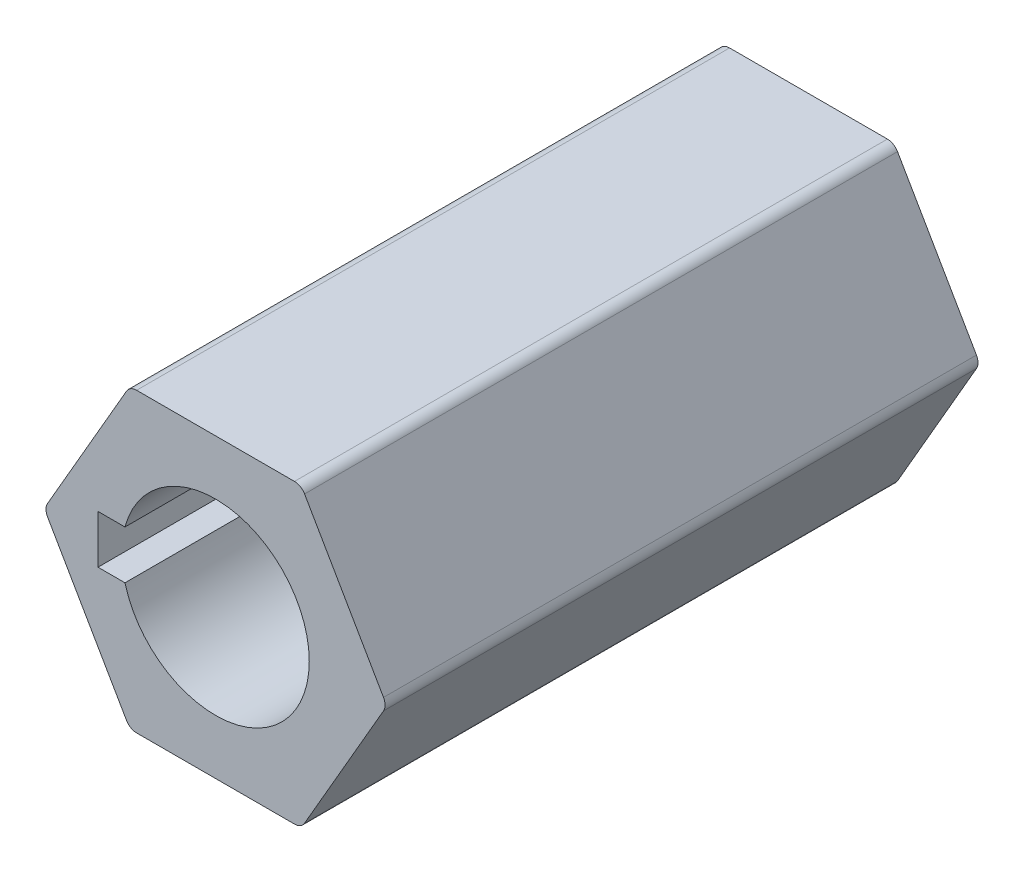
ISO-10303-21;
HEADER;
FILE_DESCRIPTION(('STEP AP214'),'2;1');
FILE_NAME('part.step','',(''),(''),'','','');
FILE_SCHEMA(('AUTOMOTIVE_DESIGN { 1 0 10303 214 1 1 1 1 }'));
ENDSEC;
DATA;
#1=APPLICATION_CONTEXT('core data for automotive mechanical design processes');
#2=APPLICATION_PROTOCOL_DEFINITION('international standard','automotive_design',2000,#1);
#3=PRODUCT_CONTEXT('',#1,'mechanical');
#4=PRODUCT('Part','Part','',(#3));
#5=PRODUCT_RELATED_PRODUCT_CATEGORY('part','',(#4));
#6=PRODUCT_DEFINITION_FORMATION('','',#4);
#7=PRODUCT_DEFINITION_CONTEXT('part definition',#1,'design');
#8=PRODUCT_DEFINITION('design','',#6,#7);
#9=PRODUCT_DEFINITION_SHAPE('','',#8);
#10=(LENGTH_UNIT() NAMED_UNIT(*) SI_UNIT(.MILLI.,.METRE.));
#11=(NAMED_UNIT(*) PLANE_ANGLE_UNIT() SI_UNIT($,.RADIAN.));
#12=(NAMED_UNIT(*) SI_UNIT($,.STERADIAN.) SOLID_ANGLE_UNIT());
#13=UNCERTAINTY_MEASURE_WITH_UNIT(LENGTH_MEASURE(1.E-05),#10,'distance_accuracy_value','');
#14=(GEOMETRIC_REPRESENTATION_CONTEXT(3) GLOBAL_UNCERTAINTY_ASSIGNED_CONTEXT((#13)) GLOBAL_UNIT_ASSIGNED_CONTEXT((#10,
#11,#12)) REPRESENTATION_CONTEXT('',''));
#15=CARTESIAN_POINT('',(0.,0.,0.));
#16=DIRECTION('',(0.,0.,1.));
#17=DIRECTION('',(1.,0.,0.));
#18=AXIS2_PLACEMENT_3D('',#15,#16,#17);
#19=CARTESIAN_POINT('',(3.38116524896868,5.85635,12.7));
#20=DIRECTION('',(0.,0.,-1.));
#21=DIRECTION('',(-1.,0.,0.));
#22=AXIS2_PLACEMENT_3D('',#19,#20,#21);
#23=CYLINDRICAL_SURFACE('',#22,0.5);
#24=CARTESIAN_POINT('',(3.38116524896868,5.85635,12.7));
#25=DIRECTION('',(0.,0.,1.));
#26=DIRECTION('',(1.,0.,0.));
#27=AXIS2_PLACEMENT_3D('',#24,#25,#26);
#28=CIRCLE('',#27,0.5);
#29=CARTESIAN_POINT('',(3.81417795086089,6.10635,12.7));
#30=VERTEX_POINT('',#29);
#31=CARTESIAN_POINT('',(3.38116524896868,6.35635,12.7));
#32=VERTEX_POINT('',#31);
#33=EDGE_CURVE('E225',#30,#32,#28,.T.);
#34=ORIENTED_EDGE('',*,*,#33,.F.);
#35=DIRECTION('',(0.,0.,1.));
#36=VECTOR('',#35,1.);
#37=CARTESIAN_POINT('',(3.81417795086089,6.10635,12.7));
#38=LINE('',#37,#36);
#39=CARTESIAN_POINT('',(3.81417795086089,6.10635,-12.7));
#40=VERTEX_POINT('',#39);
#41=EDGE_CURVE('E212',#40,#30,#38,.T.);
#42=ORIENTED_EDGE('',*,*,#41,.F.);
#43=CARTESIAN_POINT('',(3.38116524896868,5.85635,-12.7));
#44=DIRECTION('',(0.,0.,-1.));
#45=DIRECTION('',(1.,0.,0.));
#46=AXIS2_PLACEMENT_3D('',#43,#44,#45);
#47=CIRCLE('',#46,0.5);
#48=CARTESIAN_POINT('',(3.38116524896868,6.35635,-12.7));
#49=VERTEX_POINT('',#48);
#50=EDGE_CURVE('E220',#49,#40,#47,.T.);
#51=ORIENTED_EDGE('',*,*,#50,.F.);
#52=DIRECTION('',(0.,0.,-1.));
#53=VECTOR('',#52,1.);
#54=CARTESIAN_POINT('',(3.38116524896868,6.35635,12.7));
#55=LINE('',#54,#53);
#56=EDGE_CURVE('E169',#32,#49,#55,.T.);
#57=ORIENTED_EDGE('',*,*,#56,.F.);
#58=EDGE_LOOP('',(#34,#42,#51,#57));
#59=FACE_BOUND('',#58,.T.);
#60=ADVANCED_FACE('F16',(#59),#23,.T.);
#61=CARTESIAN_POINT('',(-3.38116524896865,5.85635,12.7));
#62=DIRECTION('',(0.,0.,-1.));
#63=DIRECTION('',(-1.,0.,0.));
#64=AXIS2_PLACEMENT_3D('',#61,#62,#63);
#65=CYLINDRICAL_SURFACE('',#64,0.5);
#66=CARTESIAN_POINT('',(-3.38116524896865,5.85635,12.7));
#67=DIRECTION('',(0.,0.,1.));
#68=DIRECTION('',(1.,0.,0.));
#69=AXIS2_PLACEMENT_3D('',#66,#67,#68);
#70=CIRCLE('',#69,0.5);
#71=CARTESIAN_POINT('',(-3.38116524896865,6.35635,12.7));
#72=VERTEX_POINT('',#71);
#73=CARTESIAN_POINT('',(-3.81417795086087,6.10635,12.7));
#74=VERTEX_POINT('',#73);
#75=EDGE_CURVE('E258',#72,#74,#70,.T.);
#76=ORIENTED_EDGE('',*,*,#75,.F.);
#77=DIRECTION('',(0.,0.,1.));
#78=VECTOR('',#77,1.);
#79=CARTESIAN_POINT('',(-3.38116524896865,6.35635,12.7));
#80=LINE('',#79,#78);
#81=CARTESIAN_POINT('',(-3.38116524896865,6.35635,-12.7));
#82=VERTEX_POINT('',#81);
#83=EDGE_CURVE('E237',#82,#72,#80,.T.);
#84=ORIENTED_EDGE('',*,*,#83,.F.);
#85=CARTESIAN_POINT('',(-3.38116524896865,5.85635,-12.7));
#86=DIRECTION('',(0.,0.,-1.));
#87=DIRECTION('',(1.,0.,0.));
#88=AXIS2_PLACEMENT_3D('',#85,#86,#87);
#89=CIRCLE('',#88,0.5);
#90=CARTESIAN_POINT('',(-3.81417795086087,6.10635,-12.7));
#91=VERTEX_POINT('',#90);
#92=EDGE_CURVE('E188',#91,#82,#89,.T.);
#93=ORIENTED_EDGE('',*,*,#92,.F.);
#94=DIRECTION('',(0.,0.,-1.));
#95=VECTOR('',#94,1.);
#96=CARTESIAN_POINT('',(-3.81417795086087,6.10635,12.7));
#97=LINE('',#96,#95);
#98=EDGE_CURVE('E274',#74,#91,#97,.T.);
#99=ORIENTED_EDGE('',*,*,#98,.F.);
#100=EDGE_LOOP('',(#76,#84,#93,#99));
#101=FACE_BOUND('',#100,.T.);
#102=ADVANCED_FACE('F331',(#101),#65,.T.);
#103=CARTESIAN_POINT('',(6.76233049793735,0.,12.7));
#104=DIRECTION('',(0.,0.,-1.));
#105=DIRECTION('',(-1.,0.,0.));
#106=AXIS2_PLACEMENT_3D('',#103,#104,#105);
#107=CYLINDRICAL_SURFACE('',#106,0.5);
#108=CARTESIAN_POINT('',(6.76233049793735,0.,12.7));
#109=DIRECTION('',(0.,0.,1.));
#110=DIRECTION('',(1.,0.,0.));
#111=AXIS2_PLACEMENT_3D('',#108,#109,#110);
#112=CIRCLE('',#111,0.5);
#113=CARTESIAN_POINT('',(7.19534319982957,-0.250000000000018,12.7));
#114=VERTEX_POINT('',#113);
#115=CARTESIAN_POINT('',(7.19534319982957,0.249999999999985,12.7));
#116=VERTEX_POINT('',#115);
#117=EDGE_CURVE('E20',#114,#116,#112,.T.);
#118=ORIENTED_EDGE('',*,*,#117,.F.);
#119=DIRECTION('',(0.,0.,1.));
#120=VECTOR('',#119,1.);
#121=CARTESIAN_POINT('',(7.19534319982957,-0.250000000000016,12.7));
#122=LINE('',#121,#120);
#123=CARTESIAN_POINT('',(7.19534319982957,-0.250000000000018,-12.7));
#124=VERTEX_POINT('',#123);
#125=EDGE_CURVE('E238',#124,#114,#122,.T.);
#126=ORIENTED_EDGE('',*,*,#125,.F.);
#127=CARTESIAN_POINT('',(6.76233049793735,0.,-12.7));
#128=DIRECTION('',(0.,0.,-1.));
#129=DIRECTION('',(1.,0.,0.));
#130=AXIS2_PLACEMENT_3D('',#127,#128,#129);
#131=CIRCLE('',#130,0.5);
#132=CARTESIAN_POINT('',(7.19534319982957,0.249999999999985,-12.7));
#133=VERTEX_POINT('',#132);
#134=EDGE_CURVE('E205',#133,#124,#131,.T.);
#135=ORIENTED_EDGE('',*,*,#134,.F.);
#136=DIRECTION('',(0.,0.,-1.));
#137=VECTOR('',#136,1.);
#138=CARTESIAN_POINT('',(7.19534319982957,0.249999999999985,12.7));
#139=LINE('',#138,#137);
#140=EDGE_CURVE('E215',#116,#133,#139,.T.);
#141=ORIENTED_EDGE('',*,*,#140,.F.);
#142=EDGE_LOOP('',(#118,#126,#135,#141));
#143=FACE_BOUND('',#142,.T.);
#144=ADVANCED_FACE('F18',(#143),#107,.T.);
#145=CARTESIAN_POINT('',(3.38116524896867,-5.85635,12.7));
#146=DIRECTION('',(0.,0.,-1.));
#147=DIRECTION('',(-1.,0.,0.));
#148=AXIS2_PLACEMENT_3D('',#145,#146,#147);
#149=CYLINDRICAL_SURFACE('',#148,0.5);
#150=CARTESIAN_POINT('',(3.38116524896867,-5.85635,12.7));
#151=DIRECTION('',(0.,0.,1.));
#152=DIRECTION('',(1.,0.,0.));
#153=AXIS2_PLACEMENT_3D('',#150,#151,#152);
#154=CIRCLE('',#153,0.5);
#155=CARTESIAN_POINT('',(3.38116524896867,-6.35635,12.7));
#156=VERTEX_POINT('',#155);
#157=CARTESIAN_POINT('',(3.81417795086089,-6.10635,12.7));
#158=VERTEX_POINT('',#157);
#159=EDGE_CURVE('E255',#156,#158,#154,.T.);
#160=ORIENTED_EDGE('',*,*,#159,.F.);
#161=DIRECTION('',(0.,0.,1.));
#162=VECTOR('',#161,1.);
#163=CARTESIAN_POINT('',(3.38116524896867,-6.35635,12.7));
#164=LINE('',#163,#162);
#165=CARTESIAN_POINT('',(3.38116524896867,-6.35635,-12.7));
#166=VERTEX_POINT('',#165);
#167=EDGE_CURVE('E176',#166,#156,#164,.T.);
#168=ORIENTED_EDGE('',*,*,#167,.F.);
#169=CARTESIAN_POINT('',(3.38116524896867,-5.85635,-12.7));
#170=DIRECTION('',(0.,0.,-1.));
#171=DIRECTION('',(1.,0.,0.));
#172=AXIS2_PLACEMENT_3D('',#169,#170,#171);
#173=CIRCLE('',#172,0.5);
#174=CARTESIAN_POINT('',(3.81417795086089,-6.10635,-12.7));
#175=VERTEX_POINT('',#174);
#176=EDGE_CURVE('E175',#175,#166,#173,.T.);
#177=ORIENTED_EDGE('',*,*,#176,.F.);
#178=DIRECTION('',(0.,0.,-1.));
#179=VECTOR('',#178,1.);
#180=CARTESIAN_POINT('',(3.81417795086089,-6.10635,12.7));
#181=LINE('',#180,#179);
#182=EDGE_CURVE('E179',#158,#175,#181,.T.);
#183=ORIENTED_EDGE('',*,*,#182,.F.);
#184=EDGE_LOOP('',(#160,#168,#177,#183));
#185=FACE_BOUND('',#184,.T.);
#186=ADVANCED_FACE('F451',(#185),#149,.T.);
#187=CARTESIAN_POINT('',(-6.76233049793731,0.,12.7));
#188=DIRECTION('',(0.,0.,-1.));
#189=DIRECTION('',(-1.,0.,0.));
#190=AXIS2_PLACEMENT_3D('',#187,#188,#189);
#191=CYLINDRICAL_SURFACE('',#190,0.5);
#192=DIRECTION('',(0.,0.,-1.));
#193=VECTOR('',#192,1.);
#194=CARTESIAN_POINT('',(-7.26233049793732,0.,12.7));
#195=LINE('',#194,#193);
#196=CARTESIAN_POINT('',(-7.26233049793732,0.,12.7));
#197=VERTEX_POINT('',#196);
#198=CARTESIAN_POINT('',(-7.26233049793732,0.,-12.7));
#199=VERTEX_POINT('',#198);
#200=EDGE_CURVE('E206',#197,#199,#195,.T.);
#201=ORIENTED_EDGE('',*,*,#200,.F.);
#202=CARTESIAN_POINT('',(-6.76233049793731,0.,12.7));
#203=DIRECTION('',(0.,0.,1.));
#204=DIRECTION('',(1.,0.,0.));
#205=AXIS2_PLACEMENT_3D('',#202,#203,#204);
#206=CIRCLE('',#205,0.5);
#207=CARTESIAN_POINT('',(-7.19534319982953,0.25,12.7));
#208=VERTEX_POINT('',#207);
#209=EDGE_CURVE('E183',#208,#197,#206,.T.);
#210=ORIENTED_EDGE('',*,*,#209,.F.);
#211=DIRECTION('',(0.,0.,1.));
#212=VECTOR('',#211,1.);
#213=CARTESIAN_POINT('',(-7.19534319982953,0.25,12.7));
#214=LINE('',#213,#212);
#215=CARTESIAN_POINT('',(-7.19534319982953,0.25,-12.7));
#216=VERTEX_POINT('',#215);
#217=EDGE_CURVE('E270',#216,#208,#214,.T.);
#218=ORIENTED_EDGE('',*,*,#217,.F.);
#219=CARTESIAN_POINT('',(-6.76233049793731,0.,-12.7));
#220=DIRECTION('',(0.,0.,-1.));
#221=DIRECTION('',(1.,0.,0.));
#222=AXIS2_PLACEMENT_3D('',#219,#220,#221);
#223=CIRCLE('',#222,0.5);
#224=EDGE_CURVE('E189',#199,#216,#223,.T.);
#225=ORIENTED_EDGE('',*,*,#224,.F.);
#226=EDGE_LOOP('',(#201,#210,#218,#225));
#227=FACE_BOUND('',#226,.T.);
#228=ADVANCED_FACE('F344',(#227),#191,.T.);
#229=CARTESIAN_POINT('',(-3.38116524896863,-5.85635,12.7));
#230=DIRECTION('',(0.,0.,-1.));
#231=DIRECTION('',(-1.,0.,0.));
#232=AXIS2_PLACEMENT_3D('',#229,#230,#231);
#233=CYLINDRICAL_SURFACE('',#232,0.5);
#234=CARTESIAN_POINT('',(-3.38116524896863,-5.85635,12.7));
#235=DIRECTION('',(0.,0.,1.));
#236=DIRECTION('',(1.,0.,0.));
#237=AXIS2_PLACEMENT_3D('',#234,#235,#236);
#238=CIRCLE('',#237,0.5);
#239=CARTESIAN_POINT('',(-3.81417795086084,-6.10635,12.7));
#240=VERTEX_POINT('',#239);
#241=CARTESIAN_POINT('',(-3.38116524896863,-6.35635,12.7));
#242=VERTEX_POINT('',#241);
#243=EDGE_CURVE('E256',#240,#242,#238,.T.);
#244=ORIENTED_EDGE('',*,*,#243,.F.);
#245=DIRECTION('',(0.,0.,1.));
#246=VECTOR('',#245,1.);
#247=CARTESIAN_POINT('',(-3.81417795086084,-6.10635,12.7));
#248=LINE('',#247,#246);
#249=CARTESIAN_POINT('',(-3.81417795086084,-6.10635,-12.7));
#250=VERTEX_POINT('',#249);
#251=EDGE_CURVE('E197',#250,#240,#248,.T.);
#252=ORIENTED_EDGE('',*,*,#251,.F.);
#253=CARTESIAN_POINT('',(-3.38116524896863,-5.85635,-12.7));
#254=DIRECTION('',(0.,0.,-1.));
#255=DIRECTION('',(1.,0.,0.));
#256=AXIS2_PLACEMENT_3D('',#253,#254,#255);
#257=CIRCLE('',#256,0.5);
#258=CARTESIAN_POINT('',(-3.38116524896863,-6.35635,-12.7));
#259=VERTEX_POINT('',#258);
#260=EDGE_CURVE('E234',#259,#250,#257,.T.);
#261=ORIENTED_EDGE('',*,*,#260,.F.);
#262=DIRECTION('',(0.,0.,-1.));
#263=VECTOR('',#262,1.);
#264=CARTESIAN_POINT('',(-3.38116524896863,-6.35635,12.7));
#265=LINE('',#264,#263);
#266=EDGE_CURVE('E180',#242,#259,#265,.T.);
#267=ORIENTED_EDGE('',*,*,#266,.F.);
#268=EDGE_LOOP('',(#244,#252,#261,#267));
#269=FACE_BOUND('',#268,.T.);
#270=ADVANCED_FACE('F438',(#269),#233,.T.);
#271=CARTESIAN_POINT('',(-3.87930406129759,-1.035,12.7));
#272=DIRECTION('',(0.,1.,0.));
#273=DIRECTION('',(1.,0.,0.));
#274=AXIS2_PLACEMENT_3D('',#271,#272,#273);
#275=PLANE('',#274);
#276=DIRECTION('',(1.,0.,0.));
#277=VECTOR('',#276,1.);
#278=CARTESIAN_POINT('',(-3.87930406129759,-1.035,-12.7));
#279=LINE('',#278,#277);
#280=CARTESIAN_POINT('',(-5.035,-1.035,-12.7));
#281=VERTEX_POINT('',#280);
#282=CARTESIAN_POINT('',(-3.87930406129759,-1.035,-12.7));
#283=VERTEX_POINT('',#282);
#284=EDGE_CURVE('E142',#281,#283,#279,.T.);
#285=ORIENTED_EDGE('',*,*,#284,.F.);
#286=DIRECTION('',(0.,0.,-1.));
#287=VECTOR('',#286,1.);
#288=CARTESIAN_POINT('',(-5.035,-1.035,12.7));
#289=LINE('',#288,#287);
#290=CARTESIAN_POINT('',(-5.035,-1.035,12.7));
#291=VERTEX_POINT('',#290);
#292=EDGE_CURVE('E10',#291,#281,#289,.T.);
#293=ORIENTED_EDGE('',*,*,#292,.F.);
#294=DIRECTION('',(1.,0.,0.));
#295=VECTOR('',#294,1.);
#296=CARTESIAN_POINT('',(-3.87930406129759,-1.035,12.7));
#297=LINE('',#296,#295);
#298=CARTESIAN_POINT('',(-3.87930406129759,-1.035,12.7));
#299=VERTEX_POINT('',#298);
#300=EDGE_CURVE('E139',#291,#299,#297,.T.);
#301=ORIENTED_EDGE('',*,*,#300,.T.);
#302=DIRECTION('',(0.,0.,-1.));
#303=VECTOR('',#302,1.);
#304=CARTESIAN_POINT('',(-3.87930406129759,-1.035,12.7));
#305=LINE('',#304,#303);
#306=EDGE_CURVE('E194',#299,#283,#305,.T.);
#307=ORIENTED_EDGE('',*,*,#306,.T.);
#308=EDGE_LOOP('',(#285,#293,#301,#307));
#309=FACE_BOUND('',#308,.T.);
#310=ADVANCED_FACE('F137',(#309),#275,.T.);
#311=CARTESIAN_POINT('',(-5.035,-1.035,12.7));
#312=DIRECTION('',(1.,0.,0.));
#313=DIRECTION('',(0.,1.,0.));
#314=AXIS2_PLACEMENT_3D('',#311,#312,#313);
#315=PLANE('',#314);
#316=DIRECTION('',(0.,-1.,0.));
#317=VECTOR('',#316,1.);
#318=CARTESIAN_POINT('',(-5.035,-1.035,-12.7));
#319=LINE('',#318,#317);
#320=CARTESIAN_POINT('',(-5.035,1.035,-12.7));
#321=VERTEX_POINT('',#320);
#322=EDGE_CURVE('E198',#321,#281,#319,.T.);
#323=ORIENTED_EDGE('',*,*,#322,.F.);
#324=DIRECTION('',(0.,0.,-1.));
#325=VECTOR('',#324,1.);
#326=CARTESIAN_POINT('',(-5.035,1.035,12.7));
#327=LINE('',#326,#325);
#328=CARTESIAN_POINT('',(-5.035,1.035,12.7));
#329=VERTEX_POINT('',#328);
#330=EDGE_CURVE('E27',#329,#321,#327,.T.);
#331=ORIENTED_EDGE('',*,*,#330,.F.);
#332=DIRECTION('',(0.,-1.,0.));
#333=VECTOR('',#332,1.);
#334=CARTESIAN_POINT('',(-5.035,-1.035,12.7));
#335=LINE('',#334,#333);
#336=EDGE_CURVE('E146',#329,#291,#335,.T.);
#337=ORIENTED_EDGE('',*,*,#336,.T.);
#338=ORIENTED_EDGE('',*,*,#292,.T.);
#339=EDGE_LOOP('',(#323,#331,#337,#338));
#340=FACE_BOUND('',#339,.T.);
#341=ADVANCED_FACE('F147',(#340),#315,.T.);
#342=CARTESIAN_POINT('',(-3.87930406129759,1.035,12.7));
#343=DIRECTION('',(0.,-1.,0.));
#344=DIRECTION('',(-1.,0.,0.));
#345=AXIS2_PLACEMENT_3D('',#342,#343,#344);
#346=PLANE('',#345);
#347=DIRECTION('',(-1.,0.,0.));
#348=VECTOR('',#347,1.);
#349=CARTESIAN_POINT('',(-3.87930406129759,1.035,-12.7));
#350=LINE('',#349,#348);
#351=CARTESIAN_POINT('',(-3.87930406129759,1.035,-12.7));
#352=VERTEX_POINT('',#351);
#353=EDGE_CURVE('E174',#352,#321,#350,.T.);
#354=ORIENTED_EDGE('',*,*,#353,.F.);
#355=DIRECTION('',(0.,0.,-1.));
#356=VECTOR('',#355,1.);
#357=CARTESIAN_POINT('',(-3.87930406129759,1.035,12.7));
#358=LINE('',#357,#356);
#359=CARTESIAN_POINT('',(-3.87930406129759,1.035,12.7));
#360=VERTEX_POINT('',#359);
#361=EDGE_CURVE('E190',#360,#352,#358,.T.);
#362=ORIENTED_EDGE('',*,*,#361,.F.);
#363=DIRECTION('',(-1.,0.,0.));
#364=VECTOR('',#363,1.);
#365=CARTESIAN_POINT('',(-3.87930406129759,1.035,12.7));
#366=LINE('',#365,#364);
#367=EDGE_CURVE('E165',#360,#329,#366,.T.);
#368=ORIENTED_EDGE('',*,*,#367,.T.);
#369=ORIENTED_EDGE('',*,*,#330,.T.);
#370=EDGE_LOOP('',(#354,#362,#368,#369));
#371=FACE_BOUND('',#370,.T.);
#372=ADVANCED_FACE('F487',(#371),#346,.T.);
#373=CARTESIAN_POINT('',(0.,0.,12.7));
#374=DIRECTION('',(0.,0.,-1.));
#375=DIRECTION('',(-1.,0.,0.));
#376=AXIS2_PLACEMENT_3D('',#373,#374,#375);
#377=CYLINDRICAL_SURFACE('',#376,4.015);
#378=CARTESIAN_POINT('',(0.,0.,-12.7));
#379=DIRECTION('',(0.,0.,1.));
#380=DIRECTION('',(1.,0.,0.));
#381=AXIS2_PLACEMENT_3D('',#378,#379,#380);
#382=CIRCLE('',#381,4.015);
#383=EDGE_CURVE('E171',#283,#352,#382,.T.);
#384=ORIENTED_EDGE('',*,*,#383,.F.);
#385=ORIENTED_EDGE('',*,*,#306,.F.);
#386=CARTESIAN_POINT('',(0.,0.,12.7));
#387=DIRECTION('',(0.,0.,1.));
#388=DIRECTION('',(1.,0.,0.));
#389=AXIS2_PLACEMENT_3D('',#386,#387,#388);
#390=CIRCLE('',#389,4.015);
#391=EDGE_CURVE('E157',#299,#360,#390,.T.);
#392=ORIENTED_EDGE('',*,*,#391,.T.);
#393=ORIENTED_EDGE('',*,*,#361,.T.);
#394=EDGE_LOOP('',(#384,#385,#392,#393));
#395=FACE_BOUND('',#394,.T.);
#396=ADVANCED_FACE('F482',(#395),#377,.F.);
#397=CARTESIAN_POINT('',(7.33968076712697,0.,12.7));
#398=DIRECTION('',(-0.866025403784439,-0.5,0.));
#399=DIRECTION('',(-0.5,0.866025403784439,0.));
#400=AXIS2_PLACEMENT_3D('',#397,#398,#399);
#401=PLANE('',#400);
#402=DIRECTION('',(-0.5,0.866025403784439,0.));
#403=VECTOR('',#402,1.);
#404=CARTESIAN_POINT('',(7.33968076712697,0.,12.7));
#405=LINE('',#404,#403);
#406=EDGE_CURVE('E230',#116,#30,#405,.T.);
#407=ORIENTED_EDGE('',*,*,#406,.F.);
#408=ORIENTED_EDGE('',*,*,#140,.T.);
#409=DIRECTION('',(-0.5,0.866025403784439,0.));
#410=VECTOR('',#409,1.);
#411=CARTESIAN_POINT('',(7.33968076712697,0.,-12.7));
#412=LINE('',#411,#410);
#413=EDGE_CURVE('E224',#133,#40,#412,.T.);
#414=ORIENTED_EDGE('',*,*,#413,.T.);
#415=ORIENTED_EDGE('',*,*,#41,.T.);
#416=EDGE_LOOP('',(#407,#408,#414,#415));
#417=FACE_BOUND('',#416,.T.);
#418=ADVANCED_FACE('F386',(#417),#401,.F.);
#419=CARTESIAN_POINT('',(3.66984038356348,-6.35635,12.7));
#420=DIRECTION('',(-0.866025403784438,0.5,0.));
#421=DIRECTION('',(0.,0.,1.));
#422=AXIS2_PLACEMENT_3D('',#419,#420,#421);
#423=PLANE('',#422);
#424=DIRECTION('',(0.5,0.866025403784438,0.));
#425=VECTOR('',#424,1.);
#426=CARTESIAN_POINT('',(3.66984038356348,-6.35635,12.7));
#427=LINE('',#426,#425);
#428=EDGE_CURVE('E310',#158,#114,#427,.T.);
#429=ORIENTED_EDGE('',*,*,#428,.F.);
#430=ORIENTED_EDGE('',*,*,#182,.T.);
#431=DIRECTION('',(0.5,0.866025403784438,0.));
#432=VECTOR('',#431,1.);
#433=CARTESIAN_POINT('',(3.66984038356348,-6.35635,-12.7));
#434=LINE('',#433,#432);
#435=EDGE_CURVE('E201',#175,#124,#434,.T.);
#436=ORIENTED_EDGE('',*,*,#435,.T.);
#437=ORIENTED_EDGE('',*,*,#125,.T.);
#438=EDGE_LOOP('',(#429,#430,#436,#437));
#439=FACE_BOUND('',#438,.T.);
#440=ADVANCED_FACE('F380',(#439),#423,.F.);
#441=CARTESIAN_POINT('',(-3.66984038356344,-6.35635,12.7));
#442=DIRECTION('',(0.,1.,0.));
#443=DIRECTION('',(1.,0.,0.));
#444=AXIS2_PLACEMENT_3D('',#441,#442,#443);
#445=PLANE('',#444);
#446=DIRECTION('',(1.,0.,0.));
#447=VECTOR('',#446,1.);
#448=CARTESIAN_POINT('',(-3.66984038356344,-6.35635,12.7));
#449=LINE('',#448,#447);
#450=EDGE_CURVE('E252',#242,#156,#449,.T.);
#451=ORIENTED_EDGE('',*,*,#450,.F.);
#452=ORIENTED_EDGE('',*,*,#266,.T.);
#453=DIRECTION('',(1.,0.,0.));
#454=VECTOR('',#453,1.);
#455=CARTESIAN_POINT('',(-3.66984038356344,-6.35635,-12.7));
#456=LINE('',#455,#454);
#457=EDGE_CURVE('E152',#259,#166,#456,.T.);
#458=ORIENTED_EDGE('',*,*,#457,.T.);
#459=ORIENTED_EDGE('',*,*,#167,.T.);
#460=EDGE_LOOP('',(#451,#452,#458,#459));
#461=FACE_BOUND('',#460,.T.);
#462=ADVANCED_FACE('F419',(#461),#445,.F.);
#463=CARTESIAN_POINT('',(-7.33968076712694,0.,12.7));
#464=DIRECTION('',(0.866025403784438,0.5,0.));
#465=DIRECTION('',(0.,0.,-1.));
#466=AXIS2_PLACEMENT_3D('',#463,#464,#465);
#467=PLANE('',#466);
#468=DIRECTION('',(0.5,-0.866025403784438,0.));
#469=VECTOR('',#468,1.);
#470=CARTESIAN_POINT('',(-7.33968076712694,0.,-12.7));
#471=LINE('',#470,#469);
#472=CARTESIAN_POINT('',(-7.19534319982953,-0.25,-12.7));
#473=VERTEX_POINT('',#472);
#474=EDGE_CURVE('E266',#473,#250,#471,.T.);
#475=ORIENTED_EDGE('',*,*,#474,.T.);
#476=ORIENTED_EDGE('',*,*,#251,.T.);
#477=DIRECTION('',(0.5,-0.866025403784438,0.));
#478=VECTOR('',#477,1.);
#479=CARTESIAN_POINT('',(-7.33968076712694,0.,12.7));
#480=LINE('',#479,#478);
#481=CARTESIAN_POINT('',(-7.19534319982953,-0.25,12.7));
#482=VERTEX_POINT('',#481);
#483=EDGE_CURVE('E245',#482,#240,#480,.T.);
#484=ORIENTED_EDGE('',*,*,#483,.F.);
#485=DIRECTION('',(0.,0.,-1.));
#486=VECTOR('',#485,1.);
#487=CARTESIAN_POINT('',(-7.19534319982953,-0.25,12.7));
#488=LINE('',#487,#486);
#489=EDGE_CURVE('E241',#482,#473,#488,.T.);
#490=ORIENTED_EDGE('',*,*,#489,.T.);
#491=EDGE_LOOP('',(#475,#476,#484,#490));
#492=FACE_BOUND('',#491,.T.);
#493=ADVANCED_FACE('F424',(#492),#467,.F.);
#494=CARTESIAN_POINT('',(-3.66984038356347,6.35635,12.7));
#495=DIRECTION('',(0.866025403784439,-0.5,0.));
#496=DIRECTION('',(0.,0.,-1.));
#497=AXIS2_PLACEMENT_3D('',#494,#495,#496);
#498=PLANE('',#497);
#499=DIRECTION('',(-0.5,-0.866025403784439,0.));
#500=VECTOR('',#499,1.);
#501=CARTESIAN_POINT('',(-3.66984038356347,6.35635,-12.7));
#502=LINE('',#501,#500);
#503=EDGE_CURVE('E184',#91,#216,#502,.T.);
#504=ORIENTED_EDGE('',*,*,#503,.T.);
#505=ORIENTED_EDGE('',*,*,#217,.T.);
#506=DIRECTION('',(-0.5,-0.866025403784439,0.));
#507=VECTOR('',#506,1.);
#508=CARTESIAN_POINT('',(-3.66984038356347,6.35635,12.7));
#509=LINE('',#508,#507);
#510=EDGE_CURVE('E262',#74,#208,#509,.T.);
#511=ORIENTED_EDGE('',*,*,#510,.F.);
#512=ORIENTED_EDGE('',*,*,#98,.T.);
#513=EDGE_LOOP('',(#504,#505,#511,#512));
#514=FACE_BOUND('',#513,.T.);
#515=ADVANCED_FACE('F326',(#514),#498,.F.);
#516=CARTESIAN_POINT('',(3.66984038356349,6.35635,12.7));
#517=DIRECTION('',(0.,-1.,0.));
#518=DIRECTION('',(0.,0.,-1.));
#519=AXIS2_PLACEMENT_3D('',#516,#517,#518);
#520=PLANE('',#519);
#521=DIRECTION('',(-1.,0.,0.));
#522=VECTOR('',#521,1.);
#523=CARTESIAN_POINT('',(3.66984038356349,6.35635,-12.7));
#524=LINE('',#523,#522);
#525=EDGE_CURVE('E219',#49,#82,#524,.T.);
#526=ORIENTED_EDGE('',*,*,#525,.T.);
#527=ORIENTED_EDGE('',*,*,#83,.T.);
#528=DIRECTION('',(-1.,0.,0.));
#529=VECTOR('',#528,1.);
#530=CARTESIAN_POINT('',(3.66984038356349,6.35635,12.7));
#531=LINE('',#530,#529);
#532=EDGE_CURVE('E229',#32,#72,#531,.T.);
#533=ORIENTED_EDGE('',*,*,#532,.F.);
#534=ORIENTED_EDGE('',*,*,#56,.T.);
#535=EDGE_LOOP('',(#526,#527,#533,#534));
#536=FACE_BOUND('',#535,.T.);
#537=ADVANCED_FACE('F404',(#536),#520,.F.);
#538=CARTESIAN_POINT('',(0.,0.,-12.7));
#539=DIRECTION('',(0.,0.,1.));
#540=DIRECTION('',(1.,0.,0.));
#541=AXIS2_PLACEMENT_3D('',#538,#539,#540);
#542=PLANE('',#541);
#543=ORIENTED_EDGE('',*,*,#383,.T.);
#544=ORIENTED_EDGE('',*,*,#353,.T.);
#545=ORIENTED_EDGE('',*,*,#322,.T.);
#546=ORIENTED_EDGE('',*,*,#284,.T.);
#547=EDGE_LOOP('',(#543,#544,#545,#546));
#548=FACE_BOUND('',#547,.T.);
#549=ORIENTED_EDGE('',*,*,#457,.F.);
#550=ORIENTED_EDGE('',*,*,#260,.T.);
#551=ORIENTED_EDGE('',*,*,#474,.F.);
#552=CARTESIAN_POINT('',(-6.76233049793731,0.,-12.7));
#553=DIRECTION('',(0.,0.,-1.));
#554=DIRECTION('',(1.,0.,0.));
#555=AXIS2_PLACEMENT_3D('',#552,#553,#554);
#556=CIRCLE('',#555,0.5);
#557=EDGE_CURVE('E210',#473,#199,#556,.T.);
#558=ORIENTED_EDGE('',*,*,#557,.T.);
#559=ORIENTED_EDGE('',*,*,#224,.T.);
#560=ORIENTED_EDGE('',*,*,#503,.F.);
#561=ORIENTED_EDGE('',*,*,#92,.T.);
#562=ORIENTED_EDGE('',*,*,#525,.F.);
#563=ORIENTED_EDGE('',*,*,#50,.T.);
#564=ORIENTED_EDGE('',*,*,#413,.F.);
#565=ORIENTED_EDGE('',*,*,#134,.T.);
#566=ORIENTED_EDGE('',*,*,#435,.F.);
#567=ORIENTED_EDGE('',*,*,#176,.T.);
#568=EDGE_LOOP('',(#549,#550,#551,#558,#559,#560,#561,#562,#563,#564,#565,#566,#567));
#569=FACE_BOUND('',#568,.T.);
#570=ADVANCED_FACE('F335',(#548,#569),#542,.F.);
#571=CARTESIAN_POINT('',(0.,0.,12.7));
#572=DIRECTION('',(0.,0.,1.));
#573=DIRECTION('',(1.,0.,0.));
#574=AXIS2_PLACEMENT_3D('',#571,#572,#573);
#575=PLANE('',#574);
#576=ORIENTED_EDGE('',*,*,#367,.F.);
#577=ORIENTED_EDGE('',*,*,#391,.F.);
#578=ORIENTED_EDGE('',*,*,#300,.F.);
#579=ORIENTED_EDGE('',*,*,#336,.F.);
#580=EDGE_LOOP('',(#576,#577,#578,#579));
#581=FACE_BOUND('',#580,.T.);
#582=ORIENTED_EDGE('',*,*,#483,.T.);
#583=ORIENTED_EDGE('',*,*,#243,.T.);
#584=ORIENTED_EDGE('',*,*,#450,.T.);
#585=ORIENTED_EDGE('',*,*,#159,.T.);
#586=ORIENTED_EDGE('',*,*,#428,.T.);
#587=ORIENTED_EDGE('',*,*,#117,.T.);
#588=ORIENTED_EDGE('',*,*,#406,.T.);
#589=ORIENTED_EDGE('',*,*,#33,.T.);
#590=ORIENTED_EDGE('',*,*,#532,.T.);
#591=ORIENTED_EDGE('',*,*,#75,.T.);
#592=ORIENTED_EDGE('',*,*,#510,.T.);
#593=ORIENTED_EDGE('',*,*,#209,.T.);
#594=CARTESIAN_POINT('',(-6.76233049793731,0.,12.7));
#595=DIRECTION('',(0.,0.,1.));
#596=DIRECTION('',(1.,0.,0.));
#597=AXIS2_PLACEMENT_3D('',#594,#595,#596);
#598=CIRCLE('',#597,0.5);
#599=EDGE_CURVE('E211',#197,#482,#598,.T.);
#600=ORIENTED_EDGE('',*,*,#599,.T.);
#601=EDGE_LOOP('',(#582,#583,#584,#585,#586,#587,#588,#589,#590,#591,#592,#593,#600));
#602=FACE_BOUND('',#601,.T.);
#603=ADVANCED_FACE('F154',(#581,#602),#575,.T.);
#604=CARTESIAN_POINT('',(-6.76233049793731,0.,12.7));
#605=DIRECTION('',(0.,0.,-1.));
#606=DIRECTION('',(-1.,0.,0.));
#607=AXIS2_PLACEMENT_3D('',#604,#605,#606);
#608=CYLINDRICAL_SURFACE('',#607,0.5);
#609=ORIENTED_EDGE('',*,*,#599,.F.);
#610=ORIENTED_EDGE('',*,*,#200,.T.);
#611=ORIENTED_EDGE('',*,*,#557,.F.);
#612=ORIENTED_EDGE('',*,*,#489,.F.);
#613=EDGE_LOOP('',(#609,#610,#611,#612));
#614=FACE_BOUND('',#613,.T.);
#615=ADVANCED_FACE('F459',(#614),#608,.T.);
#616=CLOSED_SHELL('',(#60,#102,#144,#186,#228,#270,#310,#341,#372,#396,#418,#440,#462,#493,#515,
#537,#570,#603,#615));
#617=MANIFOLD_SOLID_BREP('B1',#616);
#618=ADVANCED_BREP_SHAPE_REPRESENTATION('',(#18,#617),#14);
#619=SHAPE_DEFINITION_REPRESENTATION(#9,#618);
ENDSEC;
END-ISO-10303-21;
